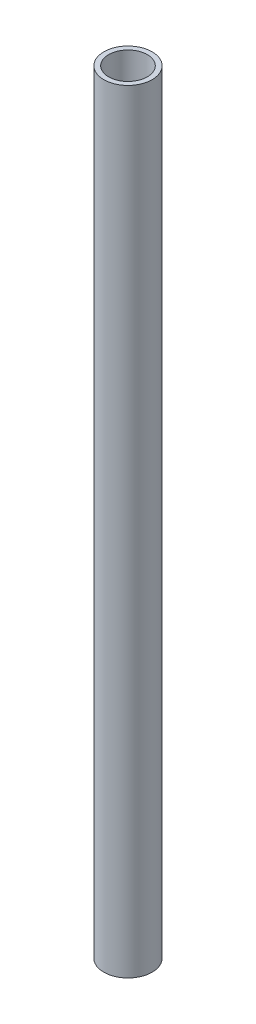
ISO-10303-21;
HEADER;
FILE_DESCRIPTION(('STEP AP214'),'2;1');
FILE_NAME('part.step','',(''),(''),'','','');
FILE_SCHEMA(('AUTOMOTIVE_DESIGN { 1 0 10303 214 1 1 1 1 }'));
ENDSEC;
DATA;
#1=APPLICATION_CONTEXT('core data for automotive mechanical design processes');
#2=APPLICATION_PROTOCOL_DEFINITION('international standard','automotive_design',2000,#1);
#3=PRODUCT_CONTEXT('',#1,'mechanical');
#4=PRODUCT('Part','Part','',(#3));
#5=PRODUCT_RELATED_PRODUCT_CATEGORY('part','',(#4));
#6=PRODUCT_DEFINITION_FORMATION('','',#4);
#7=PRODUCT_DEFINITION_CONTEXT('part definition',#1,'design');
#8=PRODUCT_DEFINITION('design','',#6,#7);
#9=PRODUCT_DEFINITION_SHAPE('','',#8);
#10=(LENGTH_UNIT() NAMED_UNIT(*) SI_UNIT(.MILLI.,.METRE.));
#11=(NAMED_UNIT(*) PLANE_ANGLE_UNIT() SI_UNIT($,.RADIAN.));
#12=(NAMED_UNIT(*) SI_UNIT($,.STERADIAN.) SOLID_ANGLE_UNIT());
#13=UNCERTAINTY_MEASURE_WITH_UNIT(LENGTH_MEASURE(1.E-05),#10,'distance_accuracy_value','');
#14=(GEOMETRIC_REPRESENTATION_CONTEXT(3) GLOBAL_UNCERTAINTY_ASSIGNED_CONTEXT((#13)) GLOBAL_UNIT_ASSIGNED_CONTEXT((#10,
#11,#12)) REPRESENTATION_CONTEXT('',''));
#15=CARTESIAN_POINT('',(0.,0.,0.));
#16=DIRECTION('',(0.,0.,1.));
#17=DIRECTION('',(1.,0.,0.));
#18=AXIS2_PLACEMENT_3D('',#15,#16,#17);
#19=CARTESIAN_POINT('',(0.,80.,0.));
#20=DIRECTION('',(0.,1.,0.));
#21=DIRECTION('',(0.,0.,1.));
#22=AXIS2_PLACEMENT_3D('',#19,#20,#21);
#23=PLANE('',#22);
#24=CARTESIAN_POINT('',(0.,80.,0.));
#25=DIRECTION('',(0.,1.,0.));
#26=DIRECTION('',(0.,0.,1.));
#27=AXIS2_PLACEMENT_3D('',#24,#25,#26);
#28=CIRCLE('',#27,2.5);
#29=CARTESIAN_POINT('',(0.,80.,2.5));
#30=VERTEX_POINT('',#29);
#31=EDGE_CURVE('E10',#30,#30,#28,.T.);
#32=ORIENTED_EDGE('',*,*,#31,.T.);
#33=EDGE_LOOP('',(#32));
#34=FACE_BOUND('',#33,.T.);
#35=CARTESIAN_POINT('',(0.,80.,0.));
#36=DIRECTION('',(0.,1.,0.));
#37=DIRECTION('',(0.,0.,1.));
#38=AXIS2_PLACEMENT_3D('',#35,#36,#37);
#39=CIRCLE('',#38,2.);
#40=CARTESIAN_POINT('',(0.,80.,2.));
#41=VERTEX_POINT('',#40);
#42=EDGE_CURVE('E54',#41,#41,#39,.T.);
#43=ORIENTED_EDGE('',*,*,#42,.F.);
#44=EDGE_LOOP('',(#43));
#45=FACE_BOUND('',#44,.T.);
#46=ADVANCED_FACE('F41',(#34,#45),#23,.T.);
#47=CARTESIAN_POINT('',(0.,0.,0.));
#48=DIRECTION('',(0.,1.,0.));
#49=DIRECTION('',(0.,0.,1.));
#50=AXIS2_PLACEMENT_3D('',#47,#48,#49);
#51=PLANE('',#50);
#52=CARTESIAN_POINT('',(0.,0.,0.));
#53=DIRECTION('',(0.,1.,0.));
#54=DIRECTION('',(0.,0.,1.));
#55=AXIS2_PLACEMENT_3D('',#52,#53,#54);
#56=CIRCLE('',#55,2.5);
#57=CARTESIAN_POINT('',(0.,0.,2.5));
#58=VERTEX_POINT('',#57);
#59=EDGE_CURVE('E45',#58,#58,#56,.T.);
#60=ORIENTED_EDGE('',*,*,#59,.F.);
#61=EDGE_LOOP('',(#60));
#62=FACE_BOUND('',#61,.T.);
#63=CARTESIAN_POINT('',(0.,0.,0.));
#64=DIRECTION('',(0.,1.,0.));
#65=DIRECTION('',(0.,0.,1.));
#66=AXIS2_PLACEMENT_3D('',#63,#64,#65);
#67=CIRCLE('',#66,2.);
#68=CARTESIAN_POINT('',(0.,0.,2.));
#69=VERTEX_POINT('',#68);
#70=EDGE_CURVE('E56',#69,#69,#67,.T.);
#71=ORIENTED_EDGE('',*,*,#70,.T.);
#72=EDGE_LOOP('',(#71));
#73=FACE_BOUND('',#72,.T.);
#74=ADVANCED_FACE('F68',(#62,#73),#51,.F.);
#75=CARTESIAN_POINT('',(0.,80.,0.));
#76=DIRECTION('',(0.,-1.,0.));
#77=DIRECTION('',(0.,0.,-1.));
#78=AXIS2_PLACEMENT_3D('',#75,#76,#77);
#79=CYLINDRICAL_SURFACE('',#78,2.5);
#80=ORIENTED_EDGE('',*,*,#31,.F.);
#81=EDGE_LOOP('',(#80));
#82=FACE_BOUND('',#81,.T.);
#83=ORIENTED_EDGE('',*,*,#59,.T.);
#84=EDGE_LOOP('',(#83));
#85=FACE_BOUND('',#84,.T.);
#86=ADVANCED_FACE('F43',(#82,#85),#79,.T.);
#87=CARTESIAN_POINT('',(0.,80.,0.));
#88=DIRECTION('',(0.,-1.,0.));
#89=DIRECTION('',(0.,0.,-1.));
#90=AXIS2_PLACEMENT_3D('',#87,#88,#89);
#91=CYLINDRICAL_SURFACE('',#90,2.);
#92=ORIENTED_EDGE('',*,*,#42,.T.);
#93=EDGE_LOOP('',(#92));
#94=FACE_BOUND('',#93,.T.);
#95=ORIENTED_EDGE('',*,*,#70,.F.);
#96=EDGE_LOOP('',(#95));
#97=FACE_BOUND('',#96,.T.);
#98=ADVANCED_FACE('F64',(#94,#97),#91,.F.);
#99=CLOSED_SHELL('',(#46,#74,#86,#98));
#100=MANIFOLD_SOLID_BREP('B2',#99);
#101=ADVANCED_BREP_SHAPE_REPRESENTATION('',(#18,#100),#14);
#102=SHAPE_DEFINITION_REPRESENTATION(#9,#101);
ENDSEC;
END-ISO-10303-21;
